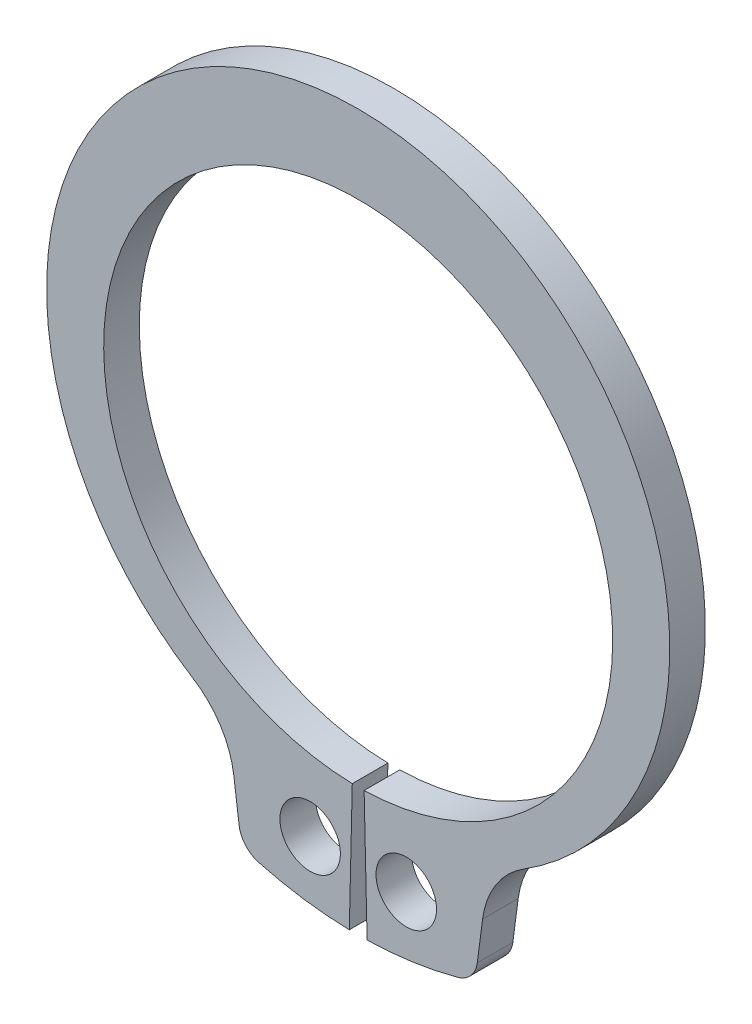
ISO-10303-21;
HEADER;
FILE_DESCRIPTION(('STEP AP214'),'2;1');
FILE_NAME('part.step','',(''),(''),'','','');
FILE_SCHEMA(('AUTOMOTIVE_DESIGN { 1 0 10303 214 1 1 1 1 }'));
ENDSEC;
DATA;
#1=APPLICATION_CONTEXT('core data for automotive mechanical design processes');
#2=APPLICATION_PROTOCOL_DEFINITION('international standard','automotive_design',2000,#1);
#3=PRODUCT_CONTEXT('',#1,'mechanical');
#4=PRODUCT('Part','Part','',(#3));
#5=PRODUCT_RELATED_PRODUCT_CATEGORY('part','',(#4));
#6=PRODUCT_DEFINITION_FORMATION('','',#4);
#7=PRODUCT_DEFINITION_CONTEXT('part definition',#1,'design');
#8=PRODUCT_DEFINITION('design','',#6,#7);
#9=PRODUCT_DEFINITION_SHAPE('','',#8);
#10=(LENGTH_UNIT() NAMED_UNIT(*) SI_UNIT(.MILLI.,.METRE.));
#11=(NAMED_UNIT(*) PLANE_ANGLE_UNIT() SI_UNIT($,.RADIAN.));
#12=(NAMED_UNIT(*) SI_UNIT($,.STERADIAN.) SOLID_ANGLE_UNIT());
#13=UNCERTAINTY_MEASURE_WITH_UNIT(LENGTH_MEASURE(1.E-05),#10,'distance_accuracy_value','');
#14=(GEOMETRIC_REPRESENTATION_CONTEXT(3) GLOBAL_UNCERTAINTY_ASSIGNED_CONTEXT((#13)) GLOBAL_UNIT_ASSIGNED_CONTEXT((#10,
#11,#12)) REPRESENTATION_CONTEXT('',''));
#15=CARTESIAN_POINT('',(0.,0.,0.));
#16=DIRECTION('',(0.,0.,1.));
#17=DIRECTION('',(1.,0.,0.));
#18=AXIS2_PLACEMENT_3D('',#15,#16,#17);
#19=CARTESIAN_POINT('',(0.,0.,-1.));
#20=DIRECTION('',(0.,0.,1.));
#21=DIRECTION('',(1.,0.,0.));
#22=AXIS2_PLACEMENT_3D('',#19,#20,#21);
#23=CYLINDRICAL_SURFACE('',#22,7.15);
#24=CARTESIAN_POINT('',(0.,0.,0.));
#25=DIRECTION('',(0.,0.,-1.));
#26=DIRECTION('',(1.,0.,0.));
#27=AXIS2_PLACEMENT_3D('',#24,#25,#26);
#28=CIRCLE('',#27,7.15);
#29=CARTESIAN_POINT('',(-0.166279069767442,-7.14806626095179,0.));
#30=VERTEX_POINT('',#29);
#31=CARTESIAN_POINT('',(0.166279069767442,-7.14806626095179,0.));
#32=VERTEX_POINT('',#31);
#33=EDGE_CURVE('E120',#30,#32,#28,.T.);
#34=ORIENTED_EDGE('',*,*,#33,.F.);
#35=DIRECTION('',(0.,0.,1.));
#36=VECTOR('',#35,1.);
#37=CARTESIAN_POINT('',(-0.166279069767442,-7.14806626095179,-1.));
#38=LINE('',#37,#36);
#39=CARTESIAN_POINT('',(-0.166279069767442,-7.14806626095179,-1.));
#40=VERTEX_POINT('',#39);
#41=EDGE_CURVE('E11',#40,#30,#38,.T.);
#42=ORIENTED_EDGE('',*,*,#41,.F.);
#43=CARTESIAN_POINT('',(0.,0.,-1.));
#44=DIRECTION('',(0.,0.,-1.));
#45=DIRECTION('',(1.,0.,0.));
#46=AXIS2_PLACEMENT_3D('',#43,#44,#45);
#47=CIRCLE('',#46,7.15);
#48=CARTESIAN_POINT('',(0.166279069767442,-7.14806626095179,-1.));
#49=VERTEX_POINT('',#48);
#50=EDGE_CURVE('E122',#40,#49,#47,.T.);
#51=ORIENTED_EDGE('',*,*,#50,.T.);
#52=DIRECTION('',(0.,0.,1.));
#53=VECTOR('',#52,1.);
#54=CARTESIAN_POINT('',(0.166279069767442,-7.14806626095179,-1.));
#55=LINE('',#54,#53);
#56=EDGE_CURVE('E35',#49,#32,#55,.T.);
#57=ORIENTED_EDGE('',*,*,#56,.T.);
#58=EDGE_LOOP('',(#34,#42,#51,#57));
#59=FACE_BOUND('',#58,.T.);
#60=ADVANCED_FACE('F32',(#59),#23,.F.);
#61=CARTESIAN_POINT('',(-0.166279069767442,-7.14806626095179,-1.));
#62=DIRECTION('',(0.999729546986264,-0.0232558139534884,0.));
#63=DIRECTION('',(0.0232558139534884,0.999729546986264,0.));
#64=AXIS2_PLACEMENT_3D('',#61,#62,#63);
#65=PLANE('',#64);
#66=DIRECTION('',(0.0232558139534884,0.999729546986264,0.));
#67=VECTOR('',#66,1.);
#68=CARTESIAN_POINT('',(-0.166279069767442,-7.14806626095179,0.));
#69=LINE('',#68,#67);
#70=CARTESIAN_POINT('',(-0.25,-10.7470926301023,0.));
#71=VERTEX_POINT('',#70);
#72=EDGE_CURVE('E138',#71,#30,#69,.T.);
#73=ORIENTED_EDGE('',*,*,#72,.F.);
#74=DIRECTION('',(0.,0.,1.));
#75=VECTOR('',#74,1.);
#76=CARTESIAN_POINT('',(-0.25,-10.7470926301023,-1.));
#77=LINE('',#76,#75);
#78=CARTESIAN_POINT('',(-0.25,-10.7470926301023,-1.));
#79=VERTEX_POINT('',#78);
#80=EDGE_CURVE('E40',#79,#71,#77,.T.);
#81=ORIENTED_EDGE('',*,*,#80,.F.);
#82=DIRECTION('',(0.0232558139534884,0.999729546986264,0.));
#83=VECTOR('',#82,1.);
#84=CARTESIAN_POINT('',(-0.166279069767442,-7.14806626095179,-1.));
#85=LINE('',#84,#83);
#86=EDGE_CURVE('E127',#79,#40,#85,.T.);
#87=ORIENTED_EDGE('',*,*,#86,.T.);
#88=ORIENTED_EDGE('',*,*,#41,.T.);
#89=EDGE_LOOP('',(#73,#81,#87,#88));
#90=FACE_BOUND('',#89,.T.);
#91=ADVANCED_FACE('F250',(#90),#65,.T.);
#92=CARTESIAN_POINT('',(0.,0.,-1.));
#93=DIRECTION('',(0.,0.,1.));
#94=DIRECTION('',(1.,0.,0.));
#95=AXIS2_PLACEMENT_3D('',#92,#93,#94);
#96=CYLINDRICAL_SURFACE('',#95,10.75);
#97=CARTESIAN_POINT('',(0.,0.,0.));
#98=DIRECTION('',(0.,0.,1.));
#99=DIRECTION('',(1.,0.,0.));
#100=AXIS2_PLACEMENT_3D('',#97,#98,#99);
#101=CIRCLE('',#100,10.75);
#102=CARTESIAN_POINT('',(-2.79605149977833,-10.3800094417388,0.));
#103=VERTEX_POINT('',#102);
#104=EDGE_CURVE('E168',#103,#71,#101,.T.);
#105=ORIENTED_EDGE('',*,*,#104,.F.);
#106=DIRECTION('',(0.,0.,1.));
#107=VECTOR('',#106,1.);
#108=CARTESIAN_POINT('',(-2.79605149977833,-10.3800094417388,-1.));
#109=LINE('',#108,#107);
#110=CARTESIAN_POINT('',(-2.79605149977833,-10.3800094417388,-1.));
#111=VERTEX_POINT('',#110);
#112=EDGE_CURVE('E202',#111,#103,#109,.T.);
#113=ORIENTED_EDGE('',*,*,#112,.F.);
#114=CARTESIAN_POINT('',(0.,0.,-1.));
#115=DIRECTION('',(0.,0.,1.));
#116=DIRECTION('',(1.,0.,0.));
#117=AXIS2_PLACEMENT_3D('',#114,#115,#116);
#118=CIRCLE('',#117,10.75);
#119=EDGE_CURVE('E198',#111,#79,#118,.T.);
#120=ORIENTED_EDGE('',*,*,#119,.T.);
#121=ORIENTED_EDGE('',*,*,#80,.T.);
#122=EDGE_LOOP('',(#105,#113,#120,#121));
#123=FACE_BOUND('',#122,.T.);
#124=ADVANCED_FACE('F255',(#123),#96,.T.);
#125=CARTESIAN_POINT('',(-2.60097813932867,-9.65582273650124,-1.));
#126=DIRECTION('',(0.,0.,1.));
#127=DIRECTION('',(1.,0.,0.));
#128=AXIS2_PLACEMENT_3D('',#125,#126,#127);
#129=CYLINDRICAL_SURFACE('',#128,0.750000000000001);
#130=CARTESIAN_POINT('',(-2.60097813932867,-9.65582273650124,0.));
#131=DIRECTION('',(0.,0.,1.));
#132=DIRECTION('',(1.,0.,0.));
#133=AXIS2_PLACEMENT_3D('',#130,#131,#132);
#134=CIRCLE('',#133,0.750000000000001);
#135=CARTESIAN_POINT('',(-3.34456178535903,-9.75371738066628,0.));
#136=VERTEX_POINT('',#135);
#137=EDGE_CURVE('E165',#136,#103,#134,.T.);
#138=ORIENTED_EDGE('',*,*,#137,.F.);
#139=DIRECTION('',(0.,0.,1.));
#140=VECTOR('',#139,1.);
#141=CARTESIAN_POINT('',(-3.34456178535903,-9.75371738066628,-1.));
#142=LINE('',#141,#140);
#143=CARTESIAN_POINT('',(-3.34456178535903,-9.75371738066628,-1.));
#144=VERTEX_POINT('',#143);
#145=EDGE_CURVE('E204',#144,#136,#142,.T.);
#146=ORIENTED_EDGE('',*,*,#145,.F.);
#147=CARTESIAN_POINT('',(-2.60097813932867,-9.65582273650124,-1.));
#148=DIRECTION('',(0.,0.,1.));
#149=DIRECTION('',(1.,0.,0.));
#150=AXIS2_PLACEMENT_3D('',#147,#148,#149);
#151=CIRCLE('',#150,0.750000000000001);
#152=EDGE_CURVE('E195',#144,#111,#151,.T.);
#153=ORIENTED_EDGE('',*,*,#152,.T.);
#154=ORIENTED_EDGE('',*,*,#112,.T.);
#155=EDGE_LOOP('',(#138,#146,#153,#154));
#156=FACE_BOUND('',#155,.T.);
#157=ADVANCED_FACE('F247',(#156),#129,.T.);
#158=CARTESIAN_POINT('',(-3.49482072457888,-8.61238742511343,-1.));
#159=DIRECTION('',(-0.991444861373811,-0.130526192220051,0.));
#160=DIRECTION('',(0.130526192220051,-0.991444861373811,0.));
#161=AXIS2_PLACEMENT_3D('',#158,#159,#160);
#162=PLANE('',#161);
#163=DIRECTION('',(0.130526192220051,-0.99144486137381,0.));
#164=VECTOR('',#163,1.);
#165=CARTESIAN_POINT('',(-3.49482072457888,-8.61238742511343,0.));
#166=LINE('',#165,#164);
#167=CARTESIAN_POINT('',(-3.49482072457888,-8.61238742511343,0.));
#168=VERTEX_POINT('',#167);
#169=EDGE_CURVE('E162',#168,#136,#166,.T.);
#170=ORIENTED_EDGE('',*,*,#169,.F.);
#171=DIRECTION('',(0.,0.,1.));
#172=VECTOR('',#171,1.);
#173=CARTESIAN_POINT('',(-3.49482072457888,-8.61238742511343,-1.));
#174=LINE('',#173,#172);
#175=CARTESIAN_POINT('',(-3.49482072457888,-8.61238742511343,-1.));
#176=VERTEX_POINT('',#175);
#177=EDGE_CURVE('E206',#176,#168,#174,.T.);
#178=ORIENTED_EDGE('',*,*,#177,.F.);
#179=DIRECTION('',(0.130526192220051,-0.99144486137381,0.));
#180=VECTOR('',#179,1.);
#181=CARTESIAN_POINT('',(-3.49482072457888,-8.61238742511343,-1.));
#182=LINE('',#181,#180);
#183=EDGE_CURVE('E192',#176,#144,#182,.T.);
#184=ORIENTED_EDGE('',*,*,#183,.T.);
#185=ORIENTED_EDGE('',*,*,#145,.T.);
#186=EDGE_LOOP('',(#170,#178,#184,#185));
#187=FACE_BOUND('',#186,.T.);
#188=ADVANCED_FACE('F243',(#187),#162,.T.);
#189=CARTESIAN_POINT('',(-5.97204747353082,-8.93852051370327,-1.));
#190=DIRECTION('',(0.,0.,1.));
#191=DIRECTION('',(1.,0.,0.));
#192=AXIS2_PLACEMENT_3D('',#189,#190,#191);
#193=CYLINDRICAL_SURFACE('',#192,2.49860264091676);
#194=CARTESIAN_POINT('',(-5.97204747353082,-8.93852051370327,0.));
#195=DIRECTION('',(0.,0.,-1.));
#196=DIRECTION('',(1.,0.,0.));
#197=AXIS2_PLACEMENT_3D('',#194,#195,#196);
#198=CIRCLE('',#197,2.49860264091676);
#199=CARTESIAN_POINT('',(-4.64583650946591,-6.82093234883499,0.));
#200=VERTEX_POINT('',#199);
#201=EDGE_CURVE('E159',#200,#168,#198,.T.);
#202=ORIENTED_EDGE('',*,*,#201,.F.);
#203=DIRECTION('',(0.,0.,1.));
#204=VECTOR('',#203,1.);
#205=CARTESIAN_POINT('',(-4.64583650946591,-6.82093234883499,-1.));
#206=LINE('',#205,#204);
#207=CARTESIAN_POINT('',(-4.64583650946591,-6.82093234883499,-1.));
#208=VERTEX_POINT('',#207);
#209=EDGE_CURVE('E208',#208,#200,#206,.T.);
#210=ORIENTED_EDGE('',*,*,#209,.F.);
#211=CARTESIAN_POINT('',(-5.97204747353082,-8.93852051370327,-1.));
#212=DIRECTION('',(0.,0.,-1.));
#213=DIRECTION('',(1.,0.,0.));
#214=AXIS2_PLACEMENT_3D('',#211,#212,#213);
#215=CIRCLE('',#214,2.49860264091676);
#216=EDGE_CURVE('E189',#208,#176,#215,.T.);
#217=ORIENTED_EDGE('',*,*,#216,.T.);
#218=ORIENTED_EDGE('',*,*,#177,.T.);
#219=EDGE_LOOP('',(#202,#210,#217,#218));
#220=FACE_BOUND('',#219,.T.);
#221=ADVANCED_FACE('F239',(#220),#193,.F.);
#222=CARTESIAN_POINT('',(0.,0.597169804538866,-1.));
#223=DIRECTION('',(0.,0.,1.));
#224=DIRECTION('',(1.,0.,0.));
#225=AXIS2_PLACEMENT_3D('',#222,#223,#224);
#226=CYLINDRICAL_SURFACE('',#225,8.75283019546113);
#227=CARTESIAN_POINT('',(0.,0.597169804538866,0.));
#228=DIRECTION('',(0.,0.,1.));
#229=DIRECTION('',(1.,0.,0.));
#230=AXIS2_PLACEMENT_3D('',#227,#228,#229);
#231=CIRCLE('',#230,8.75283019546113);
#232=CARTESIAN_POINT('',(4.64583650946591,-6.82093234883499,0.));
#233=VERTEX_POINT('',#232);
#234=EDGE_CURVE('E156',#233,#200,#231,.T.);
#235=ORIENTED_EDGE('',*,*,#234,.F.);
#236=DIRECTION('',(0.,0.,1.));
#237=VECTOR('',#236,1.);
#238=CARTESIAN_POINT('',(4.64583650946591,-6.82093234883499,-1.));
#239=LINE('',#238,#237);
#240=CARTESIAN_POINT('',(4.64583650946591,-6.82093234883499,-1.));
#241=VERTEX_POINT('',#240);
#242=EDGE_CURVE('E210',#241,#233,#239,.T.);
#243=ORIENTED_EDGE('',*,*,#242,.F.);
#244=CARTESIAN_POINT('',(0.,0.597169804538866,-1.));
#245=DIRECTION('',(0.,0.,1.));
#246=DIRECTION('',(1.,0.,0.));
#247=AXIS2_PLACEMENT_3D('',#244,#245,#246);
#248=CIRCLE('',#247,8.75283019546113);
#249=EDGE_CURVE('E186',#241,#208,#248,.T.);
#250=ORIENTED_EDGE('',*,*,#249,.T.);
#251=ORIENTED_EDGE('',*,*,#209,.T.);
#252=EDGE_LOOP('',(#235,#243,#250,#251));
#253=FACE_BOUND('',#252,.T.);
#254=ADVANCED_FACE('F235',(#253),#226,.T.);
#255=CARTESIAN_POINT('',(5.97204747353082,-8.93852051370327,-1.));
#256=DIRECTION('',(0.,0.,1.));
#257=DIRECTION('',(1.,0.,0.));
#258=AXIS2_PLACEMENT_3D('',#255,#256,#257);
#259=CYLINDRICAL_SURFACE('',#258,2.49860264091676);
#260=CARTESIAN_POINT('',(5.97204747353082,-8.93852051370327,0.));
#261=DIRECTION('',(0.,0.,-1.));
#262=DIRECTION('',(1.,0.,0.));
#263=AXIS2_PLACEMENT_3D('',#260,#261,#262);
#264=CIRCLE('',#263,2.49860264091676);
#265=CARTESIAN_POINT('',(3.49482072457888,-8.61238742511343,0.));
#266=VERTEX_POINT('',#265);
#267=EDGE_CURVE('E153',#266,#233,#264,.T.);
#268=ORIENTED_EDGE('',*,*,#267,.F.);
#269=DIRECTION('',(0.,0.,1.));
#270=VECTOR('',#269,1.);
#271=CARTESIAN_POINT('',(3.49482072457888,-8.61238742511343,-1.));
#272=LINE('',#271,#270);
#273=CARTESIAN_POINT('',(3.49482072457888,-8.61238742511343,-1.));
#274=VERTEX_POINT('',#273);
#275=EDGE_CURVE('E212',#274,#266,#272,.T.);
#276=ORIENTED_EDGE('',*,*,#275,.F.);
#277=CARTESIAN_POINT('',(5.97204747353082,-8.93852051370327,-1.));
#278=DIRECTION('',(0.,0.,-1.));
#279=DIRECTION('',(1.,0.,0.));
#280=AXIS2_PLACEMENT_3D('',#277,#278,#279);
#281=CIRCLE('',#280,2.49860264091676);
#282=EDGE_CURVE('E183',#274,#241,#281,.T.);
#283=ORIENTED_EDGE('',*,*,#282,.T.);
#284=ORIENTED_EDGE('',*,*,#242,.T.);
#285=EDGE_LOOP('',(#268,#276,#283,#284));
#286=FACE_BOUND('',#285,.T.);
#287=ADVANCED_FACE('F231',(#286),#259,.F.);
#288=CARTESIAN_POINT('',(3.49482072457888,-8.61238742511343,-1.));
#289=DIRECTION('',(0.991444861373811,-0.130526192220051,0.));
#290=DIRECTION('',(0.130526192220051,0.991444861373811,0.));
#291=AXIS2_PLACEMENT_3D('',#288,#289,#290);
#292=PLANE('',#291);
#293=DIRECTION('',(0.130526192220051,0.99144486137381,0.));
#294=VECTOR('',#293,1.);
#295=CARTESIAN_POINT('',(3.49482072457888,-8.61238742511343,0.));
#296=LINE('',#295,#294);
#297=CARTESIAN_POINT('',(3.34456178535903,-9.75371738066628,0.));
#298=VERTEX_POINT('',#297);
#299=EDGE_CURVE('E150',#298,#266,#296,.T.);
#300=ORIENTED_EDGE('',*,*,#299,.F.);
#301=DIRECTION('',(0.,0.,1.));
#302=VECTOR('',#301,1.);
#303=CARTESIAN_POINT('',(3.34456178535903,-9.75371738066628,-1.));
#304=LINE('',#303,#302);
#305=CARTESIAN_POINT('',(3.34456178535903,-9.75371738066628,-1.));
#306=VERTEX_POINT('',#305);
#307=EDGE_CURVE('E214',#306,#298,#304,.T.);
#308=ORIENTED_EDGE('',*,*,#307,.F.);
#309=DIRECTION('',(0.130526192220051,0.99144486137381,0.));
#310=VECTOR('',#309,1.);
#311=CARTESIAN_POINT('',(3.49482072457888,-8.61238742511343,-1.));
#312=LINE('',#311,#310);
#313=EDGE_CURVE('E180',#306,#274,#312,.T.);
#314=ORIENTED_EDGE('',*,*,#313,.T.);
#315=ORIENTED_EDGE('',*,*,#275,.T.);
#316=EDGE_LOOP('',(#300,#308,#314,#315));
#317=FACE_BOUND('',#316,.T.);
#318=ADVANCED_FACE('F227',(#317),#292,.T.);
#319=CARTESIAN_POINT('',(2.60097813932867,-9.65582273650124,-1.));
#320=DIRECTION('',(0.,0.,1.));
#321=DIRECTION('',(1.,0.,0.));
#322=AXIS2_PLACEMENT_3D('',#319,#320,#321);
#323=CYLINDRICAL_SURFACE('',#322,0.750000000000001);
#324=CARTESIAN_POINT('',(2.60097813932867,-9.65582273650124,0.));
#325=DIRECTION('',(0.,0.,1.));
#326=DIRECTION('',(-1.,0.,0.));
#327=AXIS2_PLACEMENT_3D('',#324,#325,#326);
#328=CIRCLE('',#327,0.750000000000001);
#329=CARTESIAN_POINT('',(2.79605149977832,-10.3800094417388,0.));
#330=VERTEX_POINT('',#329);
#331=EDGE_CURVE('E147',#330,#298,#328,.T.);
#332=ORIENTED_EDGE('',*,*,#331,.F.);
#333=DIRECTION('',(0.,0.,1.));
#334=VECTOR('',#333,1.);
#335=CARTESIAN_POINT('',(2.79605149977832,-10.3800094417388,-1.));
#336=LINE('',#335,#334);
#337=CARTESIAN_POINT('',(2.79605149977832,-10.3800094417388,-1.));
#338=VERTEX_POINT('',#337);
#339=EDGE_CURVE('E216',#338,#330,#336,.T.);
#340=ORIENTED_EDGE('',*,*,#339,.F.);
#341=CARTESIAN_POINT('',(2.60097813932867,-9.65582273650124,-1.));
#342=DIRECTION('',(0.,0.,1.));
#343=DIRECTION('',(-1.,0.,0.));
#344=AXIS2_PLACEMENT_3D('',#341,#342,#343);
#345=CIRCLE('',#344,0.750000000000001);
#346=EDGE_CURVE('E177',#338,#306,#345,.T.);
#347=ORIENTED_EDGE('',*,*,#346,.T.);
#348=ORIENTED_EDGE('',*,*,#307,.T.);
#349=EDGE_LOOP('',(#332,#340,#347,#348));
#350=FACE_BOUND('',#349,.T.);
#351=ADVANCED_FACE('F223',(#350),#323,.T.);
#352=CARTESIAN_POINT('',(0.,0.,-1.));
#353=DIRECTION('',(0.,0.,1.));
#354=DIRECTION('',(1.,0.,0.));
#355=AXIS2_PLACEMENT_3D('',#352,#353,#354);
#356=CYLINDRICAL_SURFACE('',#355,10.75);
#357=CARTESIAN_POINT('',(0.,0.,0.));
#358=DIRECTION('',(0.,0.,1.));
#359=DIRECTION('',(1.,0.,0.));
#360=AXIS2_PLACEMENT_3D('',#357,#358,#359);
#361=CIRCLE('',#360,10.75);
#362=CARTESIAN_POINT('',(0.249999999999996,-10.7470926301023,0.));
#363=VERTEX_POINT('',#362);
#364=EDGE_CURVE('E134',#363,#330,#361,.T.);
#365=ORIENTED_EDGE('',*,*,#364,.F.);
#366=DIRECTION('',(0.,0.,1.));
#367=VECTOR('',#366,1.);
#368=CARTESIAN_POINT('',(0.249999999999996,-10.7470926301023,-1.));
#369=LINE('',#368,#367);
#370=CARTESIAN_POINT('',(0.249999999999996,-10.7470926301023,-1.));
#371=VERTEX_POINT('',#370);
#372=EDGE_CURVE('E126',#371,#363,#369,.T.);
#373=ORIENTED_EDGE('',*,*,#372,.F.);
#374=CARTESIAN_POINT('',(0.,0.,-1.));
#375=DIRECTION('',(0.,0.,1.));
#376=DIRECTION('',(1.,0.,0.));
#377=AXIS2_PLACEMENT_3D('',#374,#375,#376);
#378=CIRCLE('',#377,10.75);
#379=EDGE_CURVE('E174',#371,#338,#378,.T.);
#380=ORIENTED_EDGE('',*,*,#379,.T.);
#381=ORIENTED_EDGE('',*,*,#339,.T.);
#382=EDGE_LOOP('',(#365,#373,#380,#381));
#383=FACE_BOUND('',#382,.T.);
#384=ADVANCED_FACE('F219',(#383),#356,.T.);
#385=CARTESIAN_POINT('',(0.166279069767442,-7.14806626095179,-1.));
#386=DIRECTION('',(-0.999729546986264,-0.0232558139534884,0.));
#387=DIRECTION('',(0.0232558139534884,-0.999729546986264,0.));
#388=AXIS2_PLACEMENT_3D('',#385,#386,#387);
#389=PLANE('',#388);
#390=DIRECTION('',(0.0232558139534884,-0.999729546986264,0.));
#391=VECTOR('',#390,1.);
#392=CARTESIAN_POINT('',(0.166279069767442,-7.14806626095179,0.));
#393=LINE('',#392,#391);
#394=EDGE_CURVE('E129',#32,#363,#393,.T.);
#395=ORIENTED_EDGE('',*,*,#394,.F.);
#396=ORIENTED_EDGE('',*,*,#56,.F.);
#397=DIRECTION('',(0.0232558139534884,-0.999729546986264,0.));
#398=VECTOR('',#397,1.);
#399=CARTESIAN_POINT('',(0.166279069767442,-7.14806626095179,-1.));
#400=LINE('',#399,#398);
#401=EDGE_CURVE('E172',#49,#371,#400,.T.);
#402=ORIENTED_EDGE('',*,*,#401,.T.);
#403=ORIENTED_EDGE('',*,*,#372,.T.);
#404=EDGE_LOOP('',(#395,#396,#402,#403));
#405=FACE_BOUND('',#404,.T.);
#406=ADVANCED_FACE('F130',(#405),#389,.T.);
#407=CARTESIAN_POINT('',(0.,0.,-1.));
#408=DIRECTION('',(0.,0.,1.));
#409=DIRECTION('',(1.,0.,0.));
#410=AXIS2_PLACEMENT_3D('',#407,#408,#409);
#411=PLANE('',#410);
#412=CARTESIAN_POINT('',(-1.35,-9.02458447796905,-1.));
#413=DIRECTION('',(0.,0.,1.));
#414=DIRECTION('',(1.,0.,0.));
#415=AXIS2_PLACEMENT_3D('',#412,#413,#414);
#416=CIRCLE('',#415,0.85);
#417=CARTESIAN_POINT('',(-0.5,-9.02458447796905,-1.));
#418=VERTEX_POINT('',#417);
#419=EDGE_CURVE('E389',#418,#418,#416,.T.);
#420=ORIENTED_EDGE('',*,*,#419,.T.);
#421=EDGE_LOOP('',(#420));
#422=FACE_BOUND('',#421,.T.);
#423=CARTESIAN_POINT('',(1.35,-9.02458447796905,-1.));
#424=DIRECTION('',(0.,0.,1.));
#425=DIRECTION('',(1.,0.,0.));
#426=AXIS2_PLACEMENT_3D('',#423,#424,#425);
#427=CIRCLE('',#426,0.85);
#428=CARTESIAN_POINT('',(2.2,-9.02458447796905,-1.));
#429=VERTEX_POINT('',#428);
#430=EDGE_CURVE('E139',#429,#429,#427,.T.);
#431=ORIENTED_EDGE('',*,*,#430,.T.);
#432=EDGE_LOOP('',(#431));
#433=FACE_BOUND('',#432,.T.);
#434=ORIENTED_EDGE('',*,*,#50,.F.);
#435=ORIENTED_EDGE('',*,*,#86,.F.);
#436=ORIENTED_EDGE('',*,*,#119,.F.);
#437=ORIENTED_EDGE('',*,*,#152,.F.);
#438=ORIENTED_EDGE('',*,*,#183,.F.);
#439=ORIENTED_EDGE('',*,*,#216,.F.);
#440=ORIENTED_EDGE('',*,*,#249,.F.);
#441=ORIENTED_EDGE('',*,*,#282,.F.);
#442=ORIENTED_EDGE('',*,*,#313,.F.);
#443=ORIENTED_EDGE('',*,*,#346,.F.);
#444=ORIENTED_EDGE('',*,*,#379,.F.);
#445=ORIENTED_EDGE('',*,*,#401,.F.);
#446=EDGE_LOOP('',(#434,#435,#436,#437,#438,#439,#440,#441,#442,#443,#444,#445));
#447=FACE_BOUND('',#446,.T.);
#448=ADVANCED_FACE('F254',(#422,#433,#447),#411,.F.);
#449=CARTESIAN_POINT('',(0.,0.,0.));
#450=DIRECTION('',(0.,0.,1.));
#451=DIRECTION('',(1.,0.,0.));
#452=AXIS2_PLACEMENT_3D('',#449,#450,#451);
#453=PLANE('',#452);
#454=CARTESIAN_POINT('',(-1.35,-9.02458447796905,0.));
#455=DIRECTION('',(0.,0.,1.));
#456=DIRECTION('',(1.,0.,0.));
#457=AXIS2_PLACEMENT_3D('',#454,#455,#456);
#458=CIRCLE('',#457,0.85);
#459=CARTESIAN_POINT('',(-0.5,-9.02458447796905,0.));
#460=VERTEX_POINT('',#459);
#461=EDGE_CURVE('E392',#460,#460,#458,.T.);
#462=ORIENTED_EDGE('',*,*,#461,.F.);
#463=EDGE_LOOP('',(#462));
#464=FACE_BOUND('',#463,.T.);
#465=CARTESIAN_POINT('',(1.35,-9.02458447796905,0.));
#466=DIRECTION('',(0.,0.,1.));
#467=DIRECTION('',(1.,0.,0.));
#468=AXIS2_PLACEMENT_3D('',#465,#466,#467);
#469=CIRCLE('',#468,0.85);
#470=CARTESIAN_POINT('',(2.2,-9.02458447796905,0.));
#471=VERTEX_POINT('',#470);
#472=EDGE_CURVE('E142',#471,#471,#469,.T.);
#473=ORIENTED_EDGE('',*,*,#472,.F.);
#474=EDGE_LOOP('',(#473));
#475=FACE_BOUND('',#474,.T.);
#476=ORIENTED_EDGE('',*,*,#33,.T.);
#477=ORIENTED_EDGE('',*,*,#394,.T.);
#478=ORIENTED_EDGE('',*,*,#364,.T.);
#479=ORIENTED_EDGE('',*,*,#331,.T.);
#480=ORIENTED_EDGE('',*,*,#299,.T.);
#481=ORIENTED_EDGE('',*,*,#267,.T.);
#482=ORIENTED_EDGE('',*,*,#234,.T.);
#483=ORIENTED_EDGE('',*,*,#201,.T.);
#484=ORIENTED_EDGE('',*,*,#169,.T.);
#485=ORIENTED_EDGE('',*,*,#137,.T.);
#486=ORIENTED_EDGE('',*,*,#104,.T.);
#487=ORIENTED_EDGE('',*,*,#72,.T.);
#488=EDGE_LOOP('',(#476,#477,#478,#479,#480,#481,#482,#483,#484,#485,#486,#487));
#489=FACE_BOUND('',#488,.T.);
#490=ADVANCED_FACE('F136',(#464,#475,#489),#453,.T.);
#491=CARTESIAN_POINT('',(1.35,-9.02458447796905,-1.));
#492=DIRECTION('',(0.,0.,1.));
#493=DIRECTION('',(1.,0.,0.));
#494=AXIS2_PLACEMENT_3D('',#491,#492,#493);
#495=CYLINDRICAL_SURFACE('',#494,0.85);
#496=ORIENTED_EDGE('',*,*,#430,.F.);
#497=EDGE_LOOP('',(#496));
#498=FACE_BOUND('',#497,.T.);
#499=ORIENTED_EDGE('',*,*,#472,.T.);
#500=EDGE_LOOP('',(#499));
#501=FACE_BOUND('',#500,.T.);
#502=ADVANCED_FACE('F362',(#498,#501),#495,.F.);
#503=CARTESIAN_POINT('',(-1.35,-9.02458447796905,-1.));
#504=DIRECTION('',(0.,0.,1.));
#505=DIRECTION('',(1.,0.,0.));
#506=AXIS2_PLACEMENT_3D('',#503,#504,#505);
#507=CYLINDRICAL_SURFACE('',#506,0.85);
#508=ORIENTED_EDGE('',*,*,#419,.F.);
#509=EDGE_LOOP('',(#508));
#510=FACE_BOUND('',#509,.T.);
#511=ORIENTED_EDGE('',*,*,#461,.T.);
#512=EDGE_LOOP('',(#511));
#513=FACE_BOUND('',#512,.T.);
#514=ADVANCED_FACE('F372',(#510,#513),#507,.F.);
#515=CLOSED_SHELL('',(#60,#91,#124,#157,#188,#221,#254,#287,#318,#351,#384,#406,#448,#490,#502,#514));
#516=MANIFOLD_SOLID_BREP('B2',#515);
#517=ADVANCED_BREP_SHAPE_REPRESENTATION('',(#18,#516),#14);
#518=SHAPE_DEFINITION_REPRESENTATION(#9,#517);
ENDSEC;
END-ISO-10303-21;
